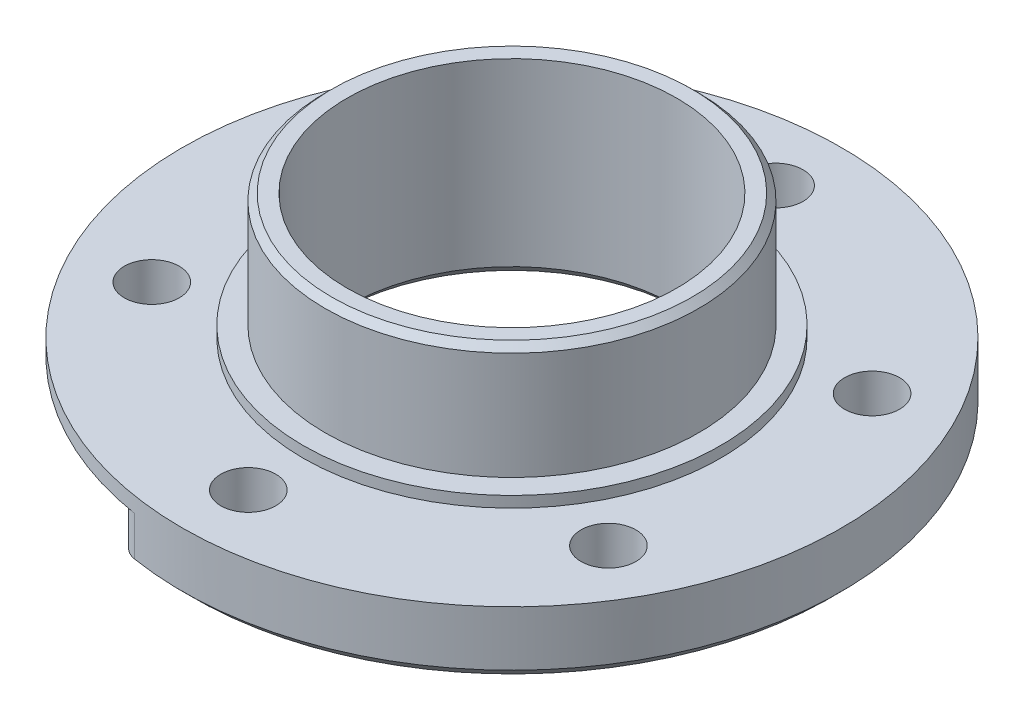
ISO-10303-21;
HEADER;
FILE_DESCRIPTION(('STEP AP214'),'2;1');
FILE_NAME('part.step','',(''),(''),'','','');
FILE_SCHEMA(('AUTOMOTIVE_DESIGN { 1 0 10303 214 1 1 1 1 }'));
ENDSEC;
DATA;
#1=APPLICATION_CONTEXT('core data for automotive mechanical design processes');
#2=APPLICATION_PROTOCOL_DEFINITION('international standard','automotive_design',2000,#1);
#3=PRODUCT_CONTEXT('',#1,'mechanical');
#4=PRODUCT('Part','Part','',(#3));
#5=PRODUCT_RELATED_PRODUCT_CATEGORY('part','',(#4));
#6=PRODUCT_DEFINITION_FORMATION('','',#4);
#7=PRODUCT_DEFINITION_CONTEXT('part definition',#1,'design');
#8=PRODUCT_DEFINITION('design','',#6,#7);
#9=PRODUCT_DEFINITION_SHAPE('','',#8);
#10=(LENGTH_UNIT() NAMED_UNIT(*) SI_UNIT(.MILLI.,.METRE.));
#11=(NAMED_UNIT(*) PLANE_ANGLE_UNIT() SI_UNIT($,.RADIAN.));
#12=(NAMED_UNIT(*) SI_UNIT($,.STERADIAN.) SOLID_ANGLE_UNIT());
#13=UNCERTAINTY_MEASURE_WITH_UNIT(LENGTH_MEASURE(1.E-05),#10,'distance_accuracy_value','');
#14=(GEOMETRIC_REPRESENTATION_CONTEXT(3) GLOBAL_UNCERTAINTY_ASSIGNED_CONTEXT((#13)) GLOBAL_UNIT_ASSIGNED_CONTEXT((#10,
#11,#12)) REPRESENTATION_CONTEXT('',''));
#15=CARTESIAN_POINT('',(0.,0.,0.));
#16=DIRECTION('',(0.,0.,1.));
#17=DIRECTION('',(1.,0.,0.));
#18=AXIS2_PLACEMENT_3D('',#15,#16,#17);
#19=CARTESIAN_POINT('',(0.,0.,0.));
#20=DIRECTION('',(0.,1.,0.));
#21=DIRECTION('',(0.,0.,1.));
#22=AXIS2_PLACEMENT_3D('',#19,#20,#21);
#23=PLANE('',#22);
#24=CARTESIAN_POINT('',(0.893195247705333,0.,8.45294044989533));
#25=DIRECTION('',(0.,1.,0.));
#26=DIRECTION('',(0.,0.,1.));
#27=AXIS2_PLACEMENT_3D('',#24,#25,#26);
#28=CIRCLE('',#27,0.499999999999999);
#29=CARTESIAN_POINT('',(0.460182545813113,0.,8.20294044989533));
#30=VERTEX_POINT('',#29);
#31=CARTESIAN_POINT('',(0.84065435078149,0.,7.95570865872502));
#32=VERTEX_POINT('',#31);
#33=EDGE_CURVE('E267',#30,#32,#28,.F.);
#34=ORIENTED_EDGE('',*,*,#33,.T.);
#35=CARTESIAN_POINT('',(0.,0.,0.));
#36=DIRECTION('',(0.,1.,0.));
#37=DIRECTION('',(0.,0.,1.));
#38=AXIS2_PLACEMENT_3D('',#35,#36,#37);
#39=CIRCLE('',#38,8.);
#40=CARTESIAN_POINT('',(-7.31017297895441,0.,3.24982630578386));
#41=VERTEX_POINT('',#40);
#42=EDGE_CURVE('E270',#32,#41,#39,.T.);
#43=ORIENTED_EDGE('',*,*,#42,.T.);
#44=CARTESIAN_POINT('',(-7.76705879013907,0.,3.45294044989535));
#45=DIRECTION('',(0.,1.,0.));
#46=DIRECTION('',(0.,0.,1.));
#47=AXIS2_PLACEMENT_3D('',#44,#45,#46);
#48=CIRCLE('',#47,0.499999999999999);
#49=CARTESIAN_POINT('',(-7.33404608824685,0.,3.70294044989535));
#50=VERTEX_POINT('',#49);
#51=EDGE_CURVE('E264',#41,#50,#48,.F.);
#52=ORIENTED_EDGE('',*,*,#51,.T.);
#53=DIRECTION('',(-0.499999999999998,0.,0.86602540378444));
#54=VECTOR('',#53,1.);
#55=CARTESIAN_POINT('',(-3.89711431702998,0.,-2.24999999999999));
#56=LINE('',#55,#54);
#57=CARTESIAN_POINT('',(-10.435462732341,0.,9.07475165290615));
#58=VERTEX_POINT('',#57);
#59=EDGE_CURVE('E258',#50,#58,#56,.T.);
#60=ORIENTED_EDGE('',*,*,#59,.T.);
#61=CARTESIAN_POINT('',(-10.8684754342332,0.,8.82475165290615));
#62=DIRECTION('',(0.,1.,0.));
#63=DIRECTION('',(0.,0.,1.));
#64=AXIS2_PLACEMENT_3D('',#61,#62,#63);
#65=CIRCLE('',#64,0.499999999999999);
#66=CARTESIAN_POINT('',(-11.2566352711701,0.,9.13992135479566));
#67=VERTEX_POINT('',#66);
#68=EDGE_CURVE('E251',#58,#67,#65,.F.);
#69=ORIENTED_EDGE('',*,*,#68,.T.);
#70=CARTESIAN_POINT('',(0.,0.,0.));
#71=DIRECTION('',(0.,1.,0.));
#72=DIRECTION('',(0.,0.,1.));
#73=AXIS2_PLACEMENT_3D('',#70,#71,#72);
#74=CIRCLE('',#73,14.5);
#75=CARTESIAN_POINT('',(-2.28708644625981,0.,14.3184927833671));
#76=VERTEX_POINT('',#75);
#77=EDGE_CURVE('E248',#67,#76,#74,.F.);
#78=ORIENTED_EDGE('',*,*,#77,.T.);
#79=CARTESIAN_POINT('',(-2.20822139638879,0.,13.8247516529061));
#80=DIRECTION('',(0.,1.,0.));
#81=DIRECTION('',(0.,0.,1.));
#82=AXIS2_PLACEMENT_3D('',#79,#80,#81);
#83=CIRCLE('',#82,0.499999999999999);
#84=CARTESIAN_POINT('',(-2.641234098281,0.,13.5747516529061));
#85=VERTEX_POINT('',#84);
#86=EDGE_CURVE('E255',#76,#85,#83,.F.);
#87=ORIENTED_EDGE('',*,*,#86,.T.);
#88=DIRECTION('',(0.499999999999998,0.,-0.86602540378444));
#89=VECTOR('',#88,1.);
#90=CARTESIAN_POINT('',(3.89711431702998,0.,2.24999999999999));
#91=LINE('',#90,#89);
#92=EDGE_CURVE('E261',#85,#30,#91,.T.);
#93=ORIENTED_EDGE('',*,*,#92,.T.);
#94=EDGE_LOOP('',(#34,#43,#52,#60,#69,#78,#87,#93));
#95=FACE_BOUND('',#94,.T.);
#96=CARTESIAN_POINT('',(-10.3923048454133,0.,6.00000000000001));
#97=DIRECTION('',(0.,-1.,0.));
#98=DIRECTION('',(0.,0.,-1.));
#99=AXIS2_PLACEMENT_3D('',#96,#97,#98);
#100=CIRCLE('',#99,1.24999999999999);
#101=CARTESIAN_POINT('',(-10.3923048454133,0.,4.75000000000002));
#102=VERTEX_POINT('',#101);
#103=EDGE_CURVE('E361',#102,#102,#100,.T.);
#104=ORIENTED_EDGE('',*,*,#103,.F.);
#105=EDGE_LOOP('',(#104));
#106=FACE_BOUND('',#105,.T.);
#107=CARTESIAN_POINT('',(0.,0.,12.));
#108=DIRECTION('',(0.,-1.,0.));
#109=DIRECTION('',(0.,0.,-1.));
#110=AXIS2_PLACEMENT_3D('',#107,#108,#109);
#111=CIRCLE('',#110,1.24999999999999);
#112=CARTESIAN_POINT('',(0.,0.,10.75));
#113=VERTEX_POINT('',#112);
#114=EDGE_CURVE('E366',#113,#113,#111,.T.);
#115=ORIENTED_EDGE('',*,*,#114,.F.);
#116=EDGE_LOOP('',(#115));
#117=FACE_BOUND('',#116,.T.);
#118=CARTESIAN_POINT('',(10.3923048454133,0.,6.));
#119=DIRECTION('',(0.,-1.,0.));
#120=DIRECTION('',(0.,0.,-1.));
#121=AXIS2_PLACEMENT_3D('',#118,#119,#120);
#122=CIRCLE('',#121,1.24999999999999);
#123=CARTESIAN_POINT('',(10.3923048454133,0.,4.75000000000001));
#124=VERTEX_POINT('',#123);
#125=EDGE_CURVE('E374',#124,#124,#122,.T.);
#126=ORIENTED_EDGE('',*,*,#125,.F.);
#127=EDGE_LOOP('',(#126));
#128=FACE_BOUND('',#127,.T.);
#129=CARTESIAN_POINT('',(10.3923048454133,0.,-6.));
#130=DIRECTION('',(0.,-1.,0.));
#131=DIRECTION('',(0.,0.,-1.));
#132=AXIS2_PLACEMENT_3D('',#129,#130,#131);
#133=CIRCLE('',#132,1.24999999999999);
#134=CARTESIAN_POINT('',(10.3923048454133,0.,-7.24999999999999));
#135=VERTEX_POINT('',#134);
#136=EDGE_CURVE('E382',#135,#135,#133,.T.);
#137=ORIENTED_EDGE('',*,*,#136,.F.);
#138=EDGE_LOOP('',(#137));
#139=FACE_BOUND('',#138,.T.);
#140=CARTESIAN_POINT('',(-10.3923048454133,0.,-6.));
#141=DIRECTION('',(0.,-1.,0.));
#142=DIRECTION('',(0.,0.,-1.));
#143=AXIS2_PLACEMENT_3D('',#140,#141,#142);
#144=CIRCLE('',#143,1.24999999999999);
#145=CARTESIAN_POINT('',(-10.3923048454133,0.,-7.24999999999999));
#146=VERTEX_POINT('',#145);
#147=EDGE_CURVE('E356',#146,#146,#144,.T.);
#148=ORIENTED_EDGE('',*,*,#147,.F.);
#149=EDGE_LOOP('',(#148));
#150=FACE_BOUND('',#149,.T.);
#151=CARTESIAN_POINT('',(0.,0.,-12.));
#152=DIRECTION('',(0.,-1.,0.));
#153=DIRECTION('',(0.,0.,-1.));
#154=AXIS2_PLACEMENT_3D('',#151,#152,#153);
#155=CIRCLE('',#154,1.24999999999999);
#156=CARTESIAN_POINT('',(0.,0.,-13.25));
#157=VERTEX_POINT('',#156);
#158=EDGE_CURVE('E347',#157,#157,#155,.T.);
#159=ORIENTED_EDGE('',*,*,#158,.F.);
#160=EDGE_LOOP('',(#159));
#161=FACE_BOUND('',#160,.T.);
#162=ADVANCED_FACE('F45',(#95,#106,#117,#128,#139,#150,#161),#23,.F.);
#163=CARTESIAN_POINT('',(0.,3.,0.));
#164=DIRECTION('',(0.,1.,0.));
#165=DIRECTION('',(0.,0.,1.));
#166=AXIS2_PLACEMENT_3D('',#163,#164,#165);
#167=PLANE('',#166);
#168=CARTESIAN_POINT('',(0.,3.,-12.));
#169=DIRECTION('',(0.,1.,0.));
#170=DIRECTION('',(0.,0.,1.));
#171=AXIS2_PLACEMENT_3D('',#168,#169,#170);
#172=CIRCLE('',#171,1.24999999999999);
#173=CARTESIAN_POINT('',(0.,3.,-10.75));
#174=VERTEX_POINT('',#173);
#175=EDGE_CURVE('E355',#174,#174,#172,.T.);
#176=ORIENTED_EDGE('',*,*,#175,.F.);
#177=EDGE_LOOP('',(#176));
#178=FACE_BOUND('',#177,.T.);
#179=CARTESIAN_POINT('',(-10.3923048454133,3.,-6.));
#180=DIRECTION('',(0.,1.,0.));
#181=DIRECTION('',(0.,0.,1.));
#182=AXIS2_PLACEMENT_3D('',#179,#180,#181);
#183=CIRCLE('',#182,1.24999999999999);
#184=CARTESIAN_POINT('',(-10.3923048454133,3.,-4.75000000000001));
#185=VERTEX_POINT('',#184);
#186=EDGE_CURVE('E360',#185,#185,#183,.T.);
#187=ORIENTED_EDGE('',*,*,#186,.F.);
#188=EDGE_LOOP('',(#187));
#189=FACE_BOUND('',#188,.T.);
#190=CARTESIAN_POINT('',(-10.3923048454133,3.,6.00000000000001));
#191=DIRECTION('',(0.,1.,0.));
#192=DIRECTION('',(0.,0.,1.));
#193=AXIS2_PLACEMENT_3D('',#190,#191,#192);
#194=CIRCLE('',#193,1.24999999999999);
#195=CARTESIAN_POINT('',(-10.3923048454133,3.,7.25));
#196=VERTEX_POINT('',#195);
#197=EDGE_CURVE('E365',#196,#196,#194,.T.);
#198=ORIENTED_EDGE('',*,*,#197,.F.);
#199=EDGE_LOOP('',(#198));
#200=FACE_BOUND('',#199,.T.);
#201=CARTESIAN_POINT('',(0.,3.,12.));
#202=DIRECTION('',(0.,1.,0.));
#203=DIRECTION('',(0.,0.,1.));
#204=AXIS2_PLACEMENT_3D('',#201,#202,#203);
#205=CIRCLE('',#204,1.24999999999999);
#206=CARTESIAN_POINT('',(0.,3.,13.25));
#207=VERTEX_POINT('',#206);
#208=EDGE_CURVE('E370',#207,#207,#205,.T.);
#209=ORIENTED_EDGE('',*,*,#208,.F.);
#210=EDGE_LOOP('',(#209));
#211=FACE_BOUND('',#210,.T.);
#212=CARTESIAN_POINT('',(10.3923048454133,3.,6.));
#213=DIRECTION('',(0.,1.,0.));
#214=DIRECTION('',(0.,0.,1.));
#215=AXIS2_PLACEMENT_3D('',#212,#213,#214);
#216=CIRCLE('',#215,1.24999999999999);
#217=CARTESIAN_POINT('',(10.3923048454133,3.,7.24999999999999));
#218=VERTEX_POINT('',#217);
#219=EDGE_CURVE('E378',#218,#218,#216,.T.);
#220=ORIENTED_EDGE('',*,*,#219,.F.);
#221=EDGE_LOOP('',(#220));
#222=FACE_BOUND('',#221,.T.);
#223=CARTESIAN_POINT('',(10.3923048454133,3.,-6.));
#224=DIRECTION('',(0.,1.,0.));
#225=DIRECTION('',(0.,0.,1.));
#226=AXIS2_PLACEMENT_3D('',#223,#224,#225);
#227=CIRCLE('',#226,1.24999999999999);
#228=CARTESIAN_POINT('',(10.3923048454133,3.,-4.75000000000001));
#229=VERTEX_POINT('',#228);
#230=EDGE_CURVE('E386',#229,#229,#227,.T.);
#231=ORIENTED_EDGE('',*,*,#230,.F.);
#232=EDGE_LOOP('',(#231));
#233=FACE_BOUND('',#232,.T.);
#234=CARTESIAN_POINT('',(0.,3.,0.));
#235=DIRECTION('',(0.,1.,0.));
#236=DIRECTION('',(0.,0.,1.));
#237=AXIS2_PLACEMENT_3D('',#234,#235,#236);
#238=CIRCLE('',#237,15.);
#239=CARTESIAN_POINT('',(0.,3.,15.));
#240=VERTEX_POINT('',#239);
#241=EDGE_CURVE('E403',#240,#240,#238,.T.);
#242=ORIENTED_EDGE('',*,*,#241,.T.);
#243=EDGE_LOOP('',(#242));
#244=FACE_BOUND('',#243,.T.);
#245=CARTESIAN_POINT('',(0.,3.,0.));
#246=DIRECTION('',(0.,1.,0.));
#247=DIRECTION('',(0.,0.,1.));
#248=AXIS2_PLACEMENT_3D('',#245,#246,#247);
#249=CIRCLE('',#248,9.5);
#250=CARTESIAN_POINT('',(0.,3.,9.5));
#251=VERTEX_POINT('',#250);
#252=EDGE_CURVE('E391',#251,#251,#249,.T.);
#253=ORIENTED_EDGE('',*,*,#252,.F.);
#254=EDGE_LOOP('',(#253));
#255=FACE_BOUND('',#254,.T.);
#256=ADVANCED_FACE('F446',(#178,#189,#200,#211,#222,#233,#244,#255),#167,.T.);
#257=CARTESIAN_POINT('',(0.,3.,0.));
#258=DIRECTION('',(0.,-1.,0.));
#259=DIRECTION('',(0.,0.,-1.));
#260=AXIS2_PLACEMENT_3D('',#257,#258,#259);
#261=CYLINDRICAL_SURFACE('',#260,15.);
#262=DIRECTION('',(0.,-1.,0.));
#263=VECTOR('',#262,1.);
#264=CARTESIAN_POINT('',(-2.36595149613084,3.,14.812233913828));
#265=LINE('',#264,#263);
#266=CARTESIAN_POINT('',(-2.36595149613084,2.3,14.812233913828));
#267=VERTEX_POINT('',#266);
#268=CARTESIAN_POINT('',(-2.36595149613084,0.499999999999999,14.812233913828));
#269=VERTEX_POINT('',#268);
#270=EDGE_CURVE('E201',#267,#269,#265,.T.);
#271=ORIENTED_EDGE('',*,*,#270,.T.);
#272=CARTESIAN_POINT('',(0.,0.499999999999999,0.));
#273=DIRECTION('',(0.,1.,0.));
#274=DIRECTION('',(0.,0.,1.));
#275=AXIS2_PLACEMENT_3D('',#272,#273,#274);
#276=CIRCLE('',#275,15.);
#277=CARTESIAN_POINT('',(-11.644795108107,0.499999999999999,9.45509105668516));
#278=VERTEX_POINT('',#277);
#279=EDGE_CURVE('E11',#269,#278,#276,.T.);
#280=ORIENTED_EDGE('',*,*,#279,.T.);
#281=DIRECTION('',(0.,-1.,0.));
#282=VECTOR('',#281,1.);
#283=CARTESIAN_POINT('',(-11.644795108107,3.,9.45509105668516));
#284=LINE('',#283,#282);
#285=CARTESIAN_POINT('',(-11.644795108107,2.3,9.45509105668516));
#286=VERTEX_POINT('',#285);
#287=EDGE_CURVE('E198',#278,#286,#284,.F.);
#288=ORIENTED_EDGE('',*,*,#287,.T.);
#289=CARTESIAN_POINT('',(0.,2.3,0.));
#290=DIRECTION('',(0.,-1.,0.));
#291=DIRECTION('',(0.,0.,-1.));
#292=AXIS2_PLACEMENT_3D('',#289,#290,#291);
#293=CIRCLE('',#292,15.);
#294=EDGE_CURVE('E342',#267,#286,#293,.T.);
#295=ORIENTED_EDGE('',*,*,#294,.F.);
#296=EDGE_LOOP('',(#271,#280,#288,#295));
#297=FACE_BOUND('',#296,.T.);
#298=ORIENTED_EDGE('',*,*,#241,.F.);
#299=EDGE_LOOP('',(#298));
#300=FACE_BOUND('',#299,.T.);
#301=ADVANCED_FACE('F441',(#297,#300),#261,.T.);
#302=CARTESIAN_POINT('',(0.,3.,0.));
#303=DIRECTION('',(0.,-1.,0.));
#304=DIRECTION('',(0.,0.,-1.));
#305=AXIS2_PLACEMENT_3D('',#302,#303,#304);
#306=CYLINDRICAL_SURFACE('',#305,7.5);
#307=DIRECTION('',(0.,-1.,0.));
#308=VECTOR('',#307,1.);
#309=CARTESIAN_POINT('',(-6.85328716776976,3.,3.04671216167237));
#310=LINE('',#309,#308);
#311=CARTESIAN_POINT('',(-6.85328716776976,3.3,3.04671216167237));
#312=VERTEX_POINT('',#311);
#313=CARTESIAN_POINT('',(-6.85328716776976,0.499999999999999,3.04671216167237));
#314=VERTEX_POINT('',#313);
#315=EDGE_CURVE('E160',#312,#314,#310,.T.);
#316=ORIENTED_EDGE('',*,*,#315,.T.);
#317=CARTESIAN_POINT('',(0.,0.499999999999999,0.));
#318=DIRECTION('',(0.,1.,0.));
#319=DIRECTION('',(0.,0.,1.));
#320=AXIS2_PLACEMENT_3D('',#317,#318,#319);
#321=CIRCLE('',#320,7.5);
#322=CARTESIAN_POINT('',(0.788113453857646,0.499999999999999,7.4584768675547));
#323=VERTEX_POINT('',#322);
#324=EDGE_CURVE('E274',#314,#323,#321,.F.);
#325=ORIENTED_EDGE('',*,*,#324,.T.);
#326=DIRECTION('',(0.,-1.,0.));
#327=VECTOR('',#326,1.);
#328=CARTESIAN_POINT('',(0.788113453857646,3.,7.4584768675547));
#329=LINE('',#328,#327);
#330=CARTESIAN_POINT('',(0.788113453857646,3.3,7.4584768675547));
#331=VERTEX_POINT('',#330);
#332=EDGE_CURVE('E173',#323,#331,#329,.F.);
#333=ORIENTED_EDGE('',*,*,#332,.T.);
#334=CARTESIAN_POINT('',(0.,3.3,0.));
#335=DIRECTION('',(0.,-1.,0.));
#336=DIRECTION('',(0.,0.,-1.));
#337=AXIS2_PLACEMENT_3D('',#334,#335,#336);
#338=CIRCLE('',#337,7.5);
#339=EDGE_CURVE('E151',#331,#312,#338,.T.);
#340=ORIENTED_EDGE('',*,*,#339,.T.);
#341=EDGE_LOOP('',(#316,#325,#333,#340));
#342=FACE_BOUND('',#341,.T.);
#343=CARTESIAN_POINT('',(0.,8.7,0.));
#344=DIRECTION('',(0.,1.,0.));
#345=DIRECTION('',(0.,0.,1.));
#346=AXIS2_PLACEMENT_3D('',#343,#344,#345);
#347=CIRCLE('',#346,7.5);
#348=CARTESIAN_POINT('',(0.,8.7,7.5));
#349=VERTEX_POINT('',#348);
#350=EDGE_CURVE('E396',#349,#349,#347,.T.);
#351=ORIENTED_EDGE('',*,*,#350,.T.);
#352=EDGE_LOOP('',(#351));
#353=FACE_BOUND('',#352,.T.);
#354=ADVANCED_FACE('F170',(#342,#353),#306,.F.);
#355=CARTESIAN_POINT('',(0.,8.7,0.));
#356=DIRECTION('',(0.,1.,0.));
#357=DIRECTION('',(0.,0.,1.));
#358=AXIS2_PLACEMENT_3D('',#355,#356,#357);
#359=PLANE('',#358);
#360=CARTESIAN_POINT('',(0.,8.7,0.));
#361=DIRECTION('',(0.,1.,0.));
#362=DIRECTION('',(0.,0.,1.));
#363=AXIS2_PLACEMENT_3D('',#360,#361,#362);
#364=CIRCLE('',#363,8.2);
#365=CARTESIAN_POINT('',(0.,8.7,8.2));
#366=VERTEX_POINT('',#365);
#367=EDGE_CURVE('E407',#366,#366,#364,.T.);
#368=ORIENTED_EDGE('',*,*,#367,.T.);
#369=EDGE_LOOP('',(#368));
#370=FACE_BOUND('',#369,.T.);
#371=ORIENTED_EDGE('',*,*,#350,.F.);
#372=EDGE_LOOP('',(#371));
#373=FACE_BOUND('',#372,.T.);
#374=ADVANCED_FACE('F435',(#370,#373),#359,.T.);
#375=CARTESIAN_POINT('',(0.,8.7,0.));
#376=DIRECTION('',(0.,-1.,0.));
#377=DIRECTION('',(0.,0.,-1.));
#378=AXIS2_PLACEMENT_3D('',#375,#376,#377);
#379=CYLINDRICAL_SURFACE('',#378,8.5);
#380=CARTESIAN_POINT('',(0.,8.39999999999999,0.));
#381=DIRECTION('',(0.,1.,0.));
#382=DIRECTION('',(0.,0.,1.));
#383=AXIS2_PLACEMENT_3D('',#380,#381,#382);
#384=CIRCLE('',#383,8.5);
#385=CARTESIAN_POINT('',(0.,8.39999999999999,8.5));
#386=VERTEX_POINT('',#385);
#387=EDGE_CURVE('E168',#386,#386,#384,.F.);
#388=ORIENTED_EDGE('',*,*,#387,.T.);
#389=EDGE_LOOP('',(#388));
#390=FACE_BOUND('',#389,.T.);
#391=CARTESIAN_POINT('',(0.,3.5,0.));
#392=DIRECTION('',(0.,1.,0.));
#393=DIRECTION('',(0.,0.,1.));
#394=AXIS2_PLACEMENT_3D('',#391,#392,#393);
#395=CIRCLE('',#394,8.5);
#396=CARTESIAN_POINT('',(0.,3.5,8.5));
#397=VERTEX_POINT('',#396);
#398=EDGE_CURVE('E387',#397,#397,#395,.T.);
#399=ORIENTED_EDGE('',*,*,#398,.T.);
#400=EDGE_LOOP('',(#399));
#401=FACE_BOUND('',#400,.T.);
#402=ADVANCED_FACE('F426',(#390,#401),#379,.T.);
#403=CARTESIAN_POINT('',(0.,3.5,0.));
#404=DIRECTION('',(0.,1.,0.));
#405=DIRECTION('',(0.,0.,1.));
#406=AXIS2_PLACEMENT_3D('',#403,#404,#405);
#407=PLANE('',#406);
#408=CARTESIAN_POINT('',(0.,3.5,0.));
#409=DIRECTION('',(0.,1.,0.));
#410=DIRECTION('',(0.,0.,1.));
#411=AXIS2_PLACEMENT_3D('',#408,#409,#410);
#412=CIRCLE('',#411,9.5);
#413=CARTESIAN_POINT('',(0.,3.5,9.5));
#414=VERTEX_POINT('',#413);
#415=EDGE_CURVE('E392',#414,#414,#412,.T.);
#416=ORIENTED_EDGE('',*,*,#415,.T.);
#417=EDGE_LOOP('',(#416));
#418=FACE_BOUND('',#417,.T.);
#419=ORIENTED_EDGE('',*,*,#398,.F.);
#420=EDGE_LOOP('',(#419));
#421=FACE_BOUND('',#420,.T.);
#422=ADVANCED_FACE('F523',(#418,#421),#407,.T.);
#423=CARTESIAN_POINT('',(0.,3.5,0.));
#424=DIRECTION('',(0.,-1.,0.));
#425=DIRECTION('',(0.,0.,-1.));
#426=AXIS2_PLACEMENT_3D('',#423,#424,#425);
#427=CYLINDRICAL_SURFACE('',#426,9.5);
#428=ORIENTED_EDGE('',*,*,#415,.F.);
#429=EDGE_LOOP('',(#428));
#430=FACE_BOUND('',#429,.T.);
#431=ORIENTED_EDGE('',*,*,#252,.T.);
#432=EDGE_LOOP('',(#431));
#433=FACE_BOUND('',#432,.T.);
#434=ADVANCED_FACE('F520',(#430,#433),#427,.T.);
#435=CARTESIAN_POINT('',(10.3923048454133,0.,-6.));
#436=DIRECTION('',(0.,-1.,0.));
#437=DIRECTION('',(0.,0.,-1.));
#438=AXIS2_PLACEMENT_3D('',#435,#436,#437);
#439=CYLINDRICAL_SURFACE('',#438,1.24999999999999);
#440=ORIENTED_EDGE('',*,*,#230,.T.);
#441=EDGE_LOOP('',(#440));
#442=FACE_BOUND('',#441,.T.);
#443=ORIENTED_EDGE('',*,*,#136,.T.);
#444=EDGE_LOOP('',(#443));
#445=FACE_BOUND('',#444,.T.);
#446=ADVANCED_FACE('F522',(#442,#445),#439,.F.);
#447=CARTESIAN_POINT('',(10.3923048454133,0.,6.));
#448=DIRECTION('',(0.,-1.,0.));
#449=DIRECTION('',(0.,0.,-1.));
#450=AXIS2_PLACEMENT_3D('',#447,#448,#449);
#451=CYLINDRICAL_SURFACE('',#450,1.24999999999999);
#452=ORIENTED_EDGE('',*,*,#219,.T.);
#453=EDGE_LOOP('',(#452));
#454=FACE_BOUND('',#453,.T.);
#455=ORIENTED_EDGE('',*,*,#125,.T.);
#456=EDGE_LOOP('',(#455));
#457=FACE_BOUND('',#456,.T.);
#458=ADVANCED_FACE('F530',(#454,#457),#451,.F.);
#459=CARTESIAN_POINT('',(0.,0.,12.));
#460=DIRECTION('',(0.,-1.,0.));
#461=DIRECTION('',(0.,0.,-1.));
#462=AXIS2_PLACEMENT_3D('',#459,#460,#461);
#463=CYLINDRICAL_SURFACE('',#462,1.24999999999999);
#464=ORIENTED_EDGE('',*,*,#208,.T.);
#465=EDGE_LOOP('',(#464));
#466=FACE_BOUND('',#465,.T.);
#467=ORIENTED_EDGE('',*,*,#114,.T.);
#468=EDGE_LOOP('',(#467));
#469=FACE_BOUND('',#468,.T.);
#470=ADVANCED_FACE('F576',(#466,#469),#463,.F.);
#471=CARTESIAN_POINT('',(-10.3923048454133,0.,6.00000000000001));
#472=DIRECTION('',(0.,-1.,0.));
#473=DIRECTION('',(0.,0.,-1.));
#474=AXIS2_PLACEMENT_3D('',#471,#472,#473);
#475=CYLINDRICAL_SURFACE('',#474,1.24999999999999);
#476=ORIENTED_EDGE('',*,*,#197,.T.);
#477=EDGE_LOOP('',(#476));
#478=FACE_BOUND('',#477,.T.);
#479=ORIENTED_EDGE('',*,*,#103,.T.);
#480=EDGE_LOOP('',(#479));
#481=FACE_BOUND('',#480,.T.);
#482=ADVANCED_FACE('F587',(#478,#481),#475,.F.);
#483=CARTESIAN_POINT('',(-10.3923048454133,0.,-6.));
#484=DIRECTION('',(0.,-1.,0.));
#485=DIRECTION('',(0.,0.,-1.));
#486=AXIS2_PLACEMENT_3D('',#483,#484,#485);
#487=CYLINDRICAL_SURFACE('',#486,1.24999999999999);
#488=ORIENTED_EDGE('',*,*,#186,.T.);
#489=EDGE_LOOP('',(#488));
#490=FACE_BOUND('',#489,.T.);
#491=ORIENTED_EDGE('',*,*,#147,.T.);
#492=EDGE_LOOP('',(#491));
#493=FACE_BOUND('',#492,.T.);
#494=ADVANCED_FACE('F598',(#490,#493),#487,.F.);
#495=CARTESIAN_POINT('',(0.,0.,-12.));
#496=DIRECTION('',(0.,-1.,0.));
#497=DIRECTION('',(0.,0.,-1.));
#498=AXIS2_PLACEMENT_3D('',#495,#496,#497);
#499=CYLINDRICAL_SURFACE('',#498,1.24999999999999);
#500=ORIENTED_EDGE('',*,*,#175,.T.);
#501=EDGE_LOOP('',(#500));
#502=FACE_BOUND('',#501,.T.);
#503=ORIENTED_EDGE('',*,*,#158,.T.);
#504=EDGE_LOOP('',(#503));
#505=FACE_BOUND('',#504,.T.);
#506=ADVANCED_FACE('F432',(#502,#505),#499,.F.);
#507=CARTESIAN_POINT('',(0.,8.7,0.));
#508=DIRECTION('',(0.,-1.,0.));
#509=DIRECTION('',(0.,0.,-1.));
#510=AXIS2_PLACEMENT_3D('',#507,#508,#509);
#511=CONICAL_SURFACE('',#510,8.2,0.785398163397443);
#512=ORIENTED_EDGE('',*,*,#387,.F.);
#513=EDGE_LOOP('',(#512));
#514=FACE_BOUND('',#513,.T.);
#515=ORIENTED_EDGE('',*,*,#367,.F.);
#516=EDGE_LOOP('',(#515));
#517=FACE_BOUND('',#516,.T.);
#518=ADVANCED_FACE('F429',(#514,#517),#511,.T.);
#519=CARTESIAN_POINT('',(-3.46410161513776,2.3,-1.99999999999999));
#520=DIRECTION('',(-0.86602540378444,0.,-0.499999999999998));
#521=DIRECTION('',(-0.499999999999998,0.,0.86602540378444));
#522=AXIS2_PLACEMENT_3D('',#519,#520,#521);
#523=PLANE('',#522);
#524=DIRECTION('',(0.,-1.,0.));
#525=VECTOR('',#524,1.);
#526=CARTESIAN_POINT('',(-10.0024500304487,2.3,9.32475165290615));
#527=LINE('',#526,#525);
#528=CARTESIAN_POINT('',(-10.0024500304487,2.3,9.32475165290614));
#529=VERTEX_POINT('',#528);
#530=CARTESIAN_POINT('',(-10.0024500304487,0.499999999999999,9.32475165290615));
#531=VERTEX_POINT('',#530);
#532=EDGE_CURVE('E191',#529,#531,#527,.T.);
#533=ORIENTED_EDGE('',*,*,#532,.T.);
#534=DIRECTION('',(0.499999999999998,0.,-0.86602540378444));
#535=VECTOR('',#534,1.);
#536=CARTESIAN_POINT('',(-3.46410161513776,0.499999999999999,-1.99999999999999));
#537=LINE('',#536,#535);
#538=CARTESIAN_POINT('',(-6.90103338635463,0.499999999999999,3.95294044989535));
#539=VERTEX_POINT('',#538);
#540=EDGE_CURVE('E285',#531,#539,#537,.T.);
#541=ORIENTED_EDGE('',*,*,#540,.T.);
#542=DIRECTION('',(0.,1.,0.));
#543=VECTOR('',#542,1.);
#544=CARTESIAN_POINT('',(-6.90103338635463,2.3,3.95294044989535));
#545=LINE('',#544,#543);
#546=CARTESIAN_POINT('',(-6.90103338635463,2.46287597992307,3.95294044989535));
#547=VERTEX_POINT('',#546);
#548=EDGE_CURVE('E195',#539,#547,#545,.T.);
#549=ORIENTED_EDGE('',*,*,#548,.T.);
#550=CARTESIAN_POINT('',(-6.90103338635463,2.46287597992307,3.95294044989535));
#551=CARTESIAN_POINT('',(-6.9323908668895,2.42744883644928,4.0072531993791));
#552=CARTESIAN_POINT('',(-6.96531614595984,2.3976477750784,4.06428145558232));
#553=CARTESIAN_POINT('',(-7.0325106849061,2.35010317092084,4.18066581102841));
#554=CARTESIAN_POINT('',(-7.0667378378873,2.33212209460164,4.23994897899027));
#555=CARTESIAN_POINT('',(-7.11992341914815,2.31327634707257,4.33206910796415));
#556=CARTESIAN_POINT('',(-7.13854365639798,2.30833971130353,4.36432030492984));
#557=CARTESIAN_POINT('',(-7.17613885320285,2.30168447980492,4.42943709591643));
#558=CARTESIAN_POINT('',(-7.19511544557667,2.3000027728294,4.46230551806241));
#559=CARTESIAN_POINT('',(-7.21410161513772,2.29999999999976,4.49519052838327));
#560=B_SPLINE_CURVE_WITH_KNOTS('',3,(#550,#551,#552,#553,#554,#555,#556,#557,#558,#559),
.UNSPECIFIED.,.F.,.F.,(4,2,2,2,4),(0.,0.215787084246655,0.427093171463114,0.539667211198458,
0.653509771900556),.UNSPECIFIED.);
#561=CARTESIAN_POINT('',(-7.21410161513774,2.3,4.49519052838331));
#562=VERTEX_POINT('',#561);
#563=EDGE_CURVE('E153',#547,#562,#560,.T.);
#564=ORIENTED_EDGE('',*,*,#563,.T.);
#565=DIRECTION('',(0.499999999999998,0.,-0.86602540378444));
#566=VECTOR('',#565,1.);
#567=CARTESIAN_POINT('',(-3.46410161513776,2.3,-1.99999999999999));
#568=LINE('',#567,#566);
#569=EDGE_CURVE('E339',#529,#562,#568,.T.);
#570=ORIENTED_EDGE('',*,*,#569,.F.);
#571=EDGE_LOOP('',(#533,#541,#549,#564,#570));
#572=FACE_BOUND('',#571,.T.);
#573=ADVANCED_FACE('F219',(#572),#523,.F.);
#574=CARTESIAN_POINT('',(3.46410161513776,2.3,1.99999999999999));
#575=DIRECTION('',(0.86602540378444,0.,0.499999999999998));
#576=DIRECTION('',(0.499999999999998,0.,-0.86602540378444));
#577=AXIS2_PLACEMENT_3D('',#574,#575,#576);
#578=PLANE('',#577);
#579=DIRECTION('',(0.,1.,0.));
#580=VECTOR('',#579,1.);
#581=CARTESIAN_POINT('',(0.0271698439208909,0.,7.95294044989533));
#582=LINE('',#581,#580);
#583=CARTESIAN_POINT('',(0.0271698439208907,2.46287597992307,7.95294044989533));
#584=VERTEX_POINT('',#583);
#585=CARTESIAN_POINT('',(0.0271698439208909,0.499999999999999,7.95294044989533));
#586=VERTEX_POINT('',#585);
#587=EDGE_CURVE('E187',#584,#586,#582,.F.);
#588=ORIENTED_EDGE('',*,*,#587,.T.);
#589=DIRECTION('',(-0.499999999999998,0.,0.86602540378444));
#590=VECTOR('',#589,1.);
#591=CARTESIAN_POINT('',(3.46410161513776,0.499999999999999,1.99999999999999));
#592=LINE('',#591,#590);
#593=CARTESIAN_POINT('',(-3.07424680017323,0.499999999999999,13.3247516529061));
#594=VERTEX_POINT('',#593);
#595=EDGE_CURVE('E282',#586,#594,#592,.T.);
#596=ORIENTED_EDGE('',*,*,#595,.T.);
#597=DIRECTION('',(0.,-1.,0.));
#598=VECTOR('',#597,1.);
#599=CARTESIAN_POINT('',(-3.07424680017323,2.3,13.3247516529061));
#600=LINE('',#599,#598);
#601=CARTESIAN_POINT('',(-3.07424680017323,2.3,13.3247516529061));
#602=VERTEX_POINT('',#601);
#603=EDGE_CURVE('E184',#594,#602,#600,.F.);
#604=ORIENTED_EDGE('',*,*,#603,.T.);
#605=DIRECTION('',(-0.499999999999998,0.,0.86602540378444));
#606=VECTOR('',#605,1.);
#607=CARTESIAN_POINT('',(3.46410161513776,2.3,1.99999999999999));
#608=LINE('',#607,#606);
#609=CARTESIAN_POINT('',(-0.285898384862229,2.3,8.49519052838329));
#610=VERTEX_POINT('',#609);
#611=EDGE_CURVE('E247',#610,#602,#608,.T.);
#612=ORIENTED_EDGE('',*,*,#611,.F.);
#613=CARTESIAN_POINT('',(-0.285898384862228,2.3,8.49519052838329));
#614=CARTESIAN_POINT('',(-0.264224735105972,2.30000994380199,8.45765066582));
#615=CARTESIAN_POINT('',(-0.24257464535587,2.30219667947712,8.4201516103844));
#616=CARTESIAN_POINT('',(-0.199470940327572,2.31090248401241,8.34549380328093));
#617=CARTESIAN_POINT('',(-0.178017549704897,2.31742600061347,8.30833544072783));
#618=CARTESIAN_POINT('',(-0.115392543730376,2.34299405974528,8.19986574855566));
#619=CARTESIAN_POINT('',(-0.0747658298249511,2.36804548793804,8.1294982159269));
#620=CARTESIAN_POINT('',(-0.0251383862323899,2.40999474139333,8.04354096217482));
#621=CARTESIAN_POINT('',(-0.014513217027878,2.41968797476592,8.02513762927359));
#622=CARTESIAN_POINT('',(0.00651936771082144,2.44033968954578,7.98870812389166));
#623=CARTESIAN_POINT('',(0.016924684449459,2.45130671788535,7.9706855866315));
#624=CARTESIAN_POINT('',(0.0271698439207603,2.46287597992369,7.95294044989556));
#625=B_SPLINE_CURVE_WITH_KNOTS('',3,(#613,#614,#615,#616,#617,#618,#619,#620,#621,#622,#623,
#624),.UNSPECIFIED.,.F.,.F.,(4,2,2,2,2,4),(0.,0.129894173219143,0.259921769998134,
0.512951483073678,0.582999806770093,0.653548724253039),.UNSPECIFIED.);
#626=EDGE_CURVE('E212',#610,#584,#625,.T.);
#627=ORIENTED_EDGE('',*,*,#626,.T.);
#628=EDGE_LOOP('',(#588,#596,#604,#612,#627));
#629=FACE_BOUND('',#628,.T.);
#630=ADVANCED_FACE('F507',(#629),#578,.F.);
#631=CARTESIAN_POINT('',(0.,2.3,0.));
#632=DIRECTION('',(0.,-1.,0.));
#633=DIRECTION('',(0.,0.,-1.));
#634=AXIS2_PLACEMENT_3D('',#631,#632,#633);
#635=PLANE('',#634);
#636=ORIENTED_EDGE('',*,*,#569,.T.);
#637=CARTESIAN_POINT('',(0.,2.3,0.));
#638=DIRECTION('',(0.,-1.,0.));
#639=DIRECTION('',(0.,0.,-1.));
#640=AXIS2_PLACEMENT_3D('',#637,#638,#639);
#641=CIRCLE('',#640,8.5);
#642=EDGE_CURVE('E178',#562,#610,#641,.F.);
#643=ORIENTED_EDGE('',*,*,#642,.T.);
#644=ORIENTED_EDGE('',*,*,#611,.T.);
#645=CARTESIAN_POINT('',(-2.20822139638879,2.3,13.8247516529061));
#646=DIRECTION('',(0.,-1.,0.));
#647=DIRECTION('',(0.,0.,-1.));
#648=AXIS2_PLACEMENT_3D('',#645,#646,#647);
#649=CIRCLE('',#648,1.);
#650=EDGE_CURVE('E504',#602,#267,#649,.F.);
#651=ORIENTED_EDGE('',*,*,#650,.T.);
#652=ORIENTED_EDGE('',*,*,#294,.T.);
#653=CARTESIAN_POINT('',(-10.8684754342332,2.3,8.82475165290615));
#654=DIRECTION('',(0.,-1.,0.));
#655=DIRECTION('',(0.,0.,-1.));
#656=AXIS2_PLACEMENT_3D('',#653,#654,#655);
#657=CIRCLE('',#656,1.);
#658=EDGE_CURVE('E252',#286,#529,#657,.F.);
#659=ORIENTED_EDGE('',*,*,#658,.T.);
#660=EDGE_LOOP('',(#636,#643,#644,#651,#652,#659));
#661=FACE_BOUND('',#660,.T.);
#662=ADVANCED_FACE('F510',(#661),#635,.T.);
#663=CARTESIAN_POINT('',(0.893195247705333,3.,8.45294044989533));
#664=DIRECTION('',(0.,-1.,0.));
#665=DIRECTION('',(0.,0.,-1.));
#666=AXIS2_PLACEMENT_3D('',#663,#664,#665);
#667=CYLINDRICAL_SURFACE('',#666,1.);
#668=ORIENTED_EDGE('',*,*,#332,.F.);
#669=CARTESIAN_POINT('',(0.893195247705333,0.499999999999999,8.45294044989533));
#670=DIRECTION('',(0.,1.,0.));
#671=DIRECTION('',(0.,0.,1.));
#672=AXIS2_PLACEMENT_3D('',#669,#670,#671);
#673=CIRCLE('',#672,1.);
#674=EDGE_CURVE('E277',#323,#586,#673,.T.);
#675=ORIENTED_EDGE('',*,*,#674,.T.);
#676=ORIENTED_EDGE('',*,*,#587,.F.);
#677=CARTESIAN_POINT('',(0.0271698439208907,2.46287597992307,7.95294044989533));
#678=CARTESIAN_POINT('',(0.0459973510286923,2.48413774298184,7.92035304339701));
#679=CARTESIAN_POINT('',(0.0661931906091203,2.50684005335499,7.8895962464022));
#680=CARTESIAN_POINT('',(0.108740870425801,2.55451121011109,7.83171378421457));
#681=CARTESIAN_POINT('',(0.131085960431762,2.57947294655658,7.80457735049806));
#682=CARTESIAN_POINT('',(0.177282715508792,2.63097299956977,7.75391660129418));
#683=CARTESIAN_POINT('',(0.201120565393501,2.65749675345027,7.73036456080895));
#684=CARTESIAN_POINT('',(0.250128848196438,2.71193337666029,7.68642322886361));
#685=CARTESIAN_POINT('',(0.275300492714617,2.73984750755837,7.66603688149777));
#686=CARTESIAN_POINT('',(0.363130429074269,2.83708455840752,7.60147572051341));
#687=CARTESIAN_POINT('',(0.42833457534896,2.90900088985863,7.56455715003543));
#688=CARTESIAN_POINT('',(0.562262685065052,3.05582850959071,7.50646322702261));
#689=CARTESIAN_POINT('',(0.630991810562054,3.13074415277213,7.48531171090322));
#690=CARTESIAN_POINT('',(0.728254512588668,3.23576104586744,7.46623934608768));
#691=CARTESIAN_POINT('',(0.755969208873828,3.26557468967715,7.46200486456403));
#692=CARTESIAN_POINT('',(0.785243011417108,3.29692681678935,7.45878331836123));
#693=CARTESIAN_POINT('',(0.786678069338498,3.29846340939622,7.45862853806585));
#694=CARTESIAN_POINT('',(0.788113453857646,3.3,7.4584768675547));
#695=B_SPLINE_CURVE_WITH_KNOTS('',3,(#677,#678,#679,#680,#681,#682,#683,#684,#685,#686,#687,
#688,#689,#690,#691,#692,#693,#694),.UNSPECIFIED.,.F.,.F.,(4,2,2,2,2,2,2,2,4),(0.,
0.129484090444622,0.258574018196578,0.386608249697188,0.514760848959463,0.824622423221441,
1.13495149715962,1.25767163355955,1.26399619582833),.UNSPECIFIED.);
#696=EDGE_CURVE('E157',#331,#584,#695,.F.);
#697=ORIENTED_EDGE('',*,*,#696,.F.);
#698=EDGE_LOOP('',(#668,#675,#676,#697));
#699=FACE_BOUND('',#698,.T.);
#700=ADVANCED_FACE('F229',(#699),#667,.T.);
#701=CARTESIAN_POINT('',(-7.76705879013907,3.,3.45294044989535));
#702=DIRECTION('',(0.,-1.,0.));
#703=DIRECTION('',(0.,0.,-1.));
#704=AXIS2_PLACEMENT_3D('',#701,#702,#703);
#705=CYLINDRICAL_SURFACE('',#704,1.);
#706=ORIENTED_EDGE('',*,*,#548,.F.);
#707=CARTESIAN_POINT('',(-7.76705879013907,0.499999999999999,3.45294044989535));
#708=DIRECTION('',(0.,1.,0.));
#709=DIRECTION('',(0.,0.,1.));
#710=AXIS2_PLACEMENT_3D('',#707,#708,#709);
#711=CIRCLE('',#710,1.);
#712=EDGE_CURVE('E163',#539,#314,#711,.T.);
#713=ORIENTED_EDGE('',*,*,#712,.T.);
#714=ORIENTED_EDGE('',*,*,#315,.F.);
#715=CARTESIAN_POINT('',(-6.90103338635463,2.46287597992307,3.95294044989535));
#716=CARTESIAN_POINT('',(-6.88222561803753,2.48413774298184,3.9203416472009));
#717=CARTESIAN_POINT('',(-6.8656873702912,2.50684005335499,3.88747313857609));
#718=CARTESIAN_POINT('',(-6.83683352751146,2.55451121011108,3.82168453588895));
#719=CARTESIAN_POINT('',(-6.82450523154783,2.57947294655658,3.78876490343568));
#720=CARTESIAN_POINT('',(-6.80373011330103,2.63097299956976,3.72342696536462));
#721=CARTESIAN_POINT('',(-6.79525237287222,2.65749675345027,3.69100676155025));
#722=CARTESIAN_POINT('',(-6.7817022045329,2.71193337666029,3.62659367767438));
#723=CARTESIAN_POINT('',(-6.7766329320828,2.73984750755836,3.59460122038368));
#724=CARTESIAN_POINT('',(-6.76463629475235,2.83708455840754,3.48625768379129));
#725=CARTESIAN_POINT('',(-6.76526594798433,2.9090008898587,3.4113299514464));
#726=CARTESIAN_POINT('',(-6.78191918970784,3.05582850959064,3.26629784464488));
#727=CARTESIAN_POINT('',(-6.79796600216848,3.13074415277186,3.1962009179247));
#728=CARTESIAN_POINT('',(-6.83008020074111,3.23576104586756,3.10243276472155));
#729=CARTESIAN_POINT('',(-6.84027038031227,3.26557468967747,3.07631389291879));
#730=CARTESIAN_POINT('',(-6.85211734073295,3.29692681678938,3.04935126314927));
#731=CARTESIAN_POINT('',(-6.85270082602584,3.29846340939623,3.04803107638574));
#732=CARTESIAN_POINT('',(-6.85328716776976,3.3,3.04671216167237));
#733=B_SPLINE_CURVE_WITH_KNOTS('',3,(#715,#716,#717,#718,#719,#720,#721,#722,#723,#724,#725,
#726,#727,#728,#729,#730,#731,#732),.UNSPECIFIED.,.F.,.F.,(4,2,2,2,2,2,2,2,4),(0.,
0.129484090444617,0.258574018196569,0.386608249697183,0.514760848959462,0.824622423221442,
1.13495149715961,1.25767163355954,1.26399619582833),.UNSPECIFIED.);
#734=EDGE_CURVE('E145',#547,#312,#733,.T.);
#735=ORIENTED_EDGE('',*,*,#734,.F.);
#736=EDGE_LOOP('',(#706,#713,#714,#735));
#737=FACE_BOUND('',#736,.T.);
#738=ADVANCED_FACE('F161',(#737),#705,.T.);
#739=CARTESIAN_POINT('',(0.,3.3,0.));
#740=DIRECTION('',(0.,-1.,0.));
#741=DIRECTION('',(0.,0.,-1.));
#742=AXIS2_PLACEMENT_3D('',#739,#740,#741);
#743=TOROIDAL_SURFACE('',#742,8.5,1.);
#744=ORIENTED_EDGE('',*,*,#626,.F.);
#745=ORIENTED_EDGE('',*,*,#642,.F.);
#746=ORIENTED_EDGE('',*,*,#563,.F.);
#747=ORIENTED_EDGE('',*,*,#734,.T.);
#748=ORIENTED_EDGE('',*,*,#339,.F.);
#749=ORIENTED_EDGE('',*,*,#696,.T.);
#750=EDGE_LOOP('',(#744,#745,#746,#747,#748,#749));
#751=FACE_BOUND('',#750,.T.);
#752=ADVANCED_FACE('F148',(#751),#743,.T.);
#753=CARTESIAN_POINT('',(-2.20822139638879,3.,13.8247516529061));
#754=DIRECTION('',(0.,-1.,0.));
#755=DIRECTION('',(0.,0.,-1.));
#756=AXIS2_PLACEMENT_3D('',#753,#754,#755);
#757=CYLINDRICAL_SURFACE('',#756,1.);
#758=ORIENTED_EDGE('',*,*,#603,.F.);
#759=CARTESIAN_POINT('',(-2.20822139638879,0.499999999999999,13.8247516529061));
#760=DIRECTION('',(0.,1.,0.));
#761=DIRECTION('',(0.,0.,1.));
#762=AXIS2_PLACEMENT_3D('',#759,#760,#761);
#763=CIRCLE('',#762,1.);
#764=EDGE_CURVE('E70',#594,#269,#763,.T.);
#765=ORIENTED_EDGE('',*,*,#764,.T.);
#766=ORIENTED_EDGE('',*,*,#270,.F.);
#767=ORIENTED_EDGE('',*,*,#650,.F.);
#768=EDGE_LOOP('',(#758,#765,#766,#767));
#769=FACE_BOUND('',#768,.T.);
#770=ADVANCED_FACE('F226',(#769),#757,.T.);
#771=CARTESIAN_POINT('',(-10.8684754342332,3.,8.82475165290615));
#772=DIRECTION('',(0.,-1.,0.));
#773=DIRECTION('',(0.,0.,-1.));
#774=AXIS2_PLACEMENT_3D('',#771,#772,#773);
#775=CYLINDRICAL_SURFACE('',#774,1.);
#776=ORIENTED_EDGE('',*,*,#287,.F.);
#777=CARTESIAN_POINT('',(-10.8684754342332,0.499999999999999,8.82475165290615));
#778=DIRECTION('',(0.,1.,0.));
#779=DIRECTION('',(0.,0.,1.));
#780=AXIS2_PLACEMENT_3D('',#777,#778,#779);
#781=CIRCLE('',#780,1.);
#782=EDGE_CURVE('E56',#278,#531,#781,.T.);
#783=ORIENTED_EDGE('',*,*,#782,.T.);
#784=ORIENTED_EDGE('',*,*,#532,.F.);
#785=ORIENTED_EDGE('',*,*,#658,.F.);
#786=EDGE_LOOP('',(#776,#783,#784,#785));
#787=FACE_BOUND('',#786,.T.);
#788=ADVANCED_FACE('F334',(#787),#775,.T.);
#789=CARTESIAN_POINT('',(0.,0.499999999999999,0.));
#790=DIRECTION('',(0.,1.,0.));
#791=DIRECTION('',(0.,0.,1.));
#792=AXIS2_PLACEMENT_3D('',#789,#790,#791);
#793=CONICAL_SURFACE('',#792,15.,0.78539816339745);
#794=DIRECTION('',(0.548940905764692,-0.707106781186547,-0.445717266861224));
#795=VECTOR('',#794,1.);
#796=CARTESIAN_POINT('',(-11.644795108107,0.499999999999999,9.45509105668516));
#797=LINE('',#796,#795);
#798=EDGE_CURVE('E313',#278,#67,#797,.T.);
#799=ORIENTED_EDGE('',*,*,#798,.F.);
#800=ORIENTED_EDGE('',*,*,#279,.F.);
#801=DIRECTION('',(-0.111532023124838,0.707106781186547,0.698255402999276));
#802=VECTOR('',#801,1.);
#803=CARTESIAN_POINT('',(-2.28708644625981,0.,14.3184927833671));
#804=LINE('',#803,#802);
#805=EDGE_CURVE('E50',#76,#269,#804,.T.);
#806=ORIENTED_EDGE('',*,*,#805,.F.);
#807=ORIENTED_EDGE('',*,*,#77,.F.);
#808=EDGE_LOOP('',(#799,#800,#806,#807));
#809=FACE_BOUND('',#808,.T.);
#810=ADVANCED_FACE('F48',(#809),#793,.T.);
#811=CARTESIAN_POINT('',(-2.20822139638879,0.,13.8247516529061));
#812=DIRECTION('',(0.,1.,0.));
#813=DIRECTION('',(0.,0.,1.));
#814=AXIS2_PLACEMENT_3D('',#811,#812,#813);
#815=CONICAL_SURFACE('',#814,0.499999999999999,0.785398163397451);
#816=ORIENTED_EDGE('',*,*,#805,.T.);
#817=ORIENTED_EDGE('',*,*,#764,.F.);
#818=DIRECTION('',(-0.612372435695797,0.707106781186546,-0.353553390593272));
#819=VECTOR('',#818,1.);
#820=CARTESIAN_POINT('',(-2.641234098281,0.,13.5747516529061));
#821=LINE('',#820,#819);
#822=EDGE_CURVE('E310',#85,#594,#821,.T.);
#823=ORIENTED_EDGE('',*,*,#822,.F.);
#824=ORIENTED_EDGE('',*,*,#86,.F.);
#825=EDGE_LOOP('',(#816,#817,#823,#824));
#826=FACE_BOUND('',#825,.T.);
#827=ADVANCED_FACE('F325',(#826),#815,.T.);
#828=CARTESIAN_POINT('',(-10.8684754342332,0.,8.82475165290615));
#829=DIRECTION('',(0.,1.,0.));
#830=DIRECTION('',(0.,0.,1.));
#831=AXIS2_PLACEMENT_3D('',#828,#829,#830);
#832=CONICAL_SURFACE('',#831,0.499999999999999,0.785398163397451);
#833=ORIENTED_EDGE('',*,*,#798,.T.);
#834=ORIENTED_EDGE('',*,*,#68,.F.);
#835=DIRECTION('',(-0.612372435695796,-0.707106781186546,-0.353553390593274));
#836=VECTOR('',#835,1.);
#837=CARTESIAN_POINT('',(-10.0024500304487,0.499999999999999,9.32475165290615));
#838=LINE('',#837,#836);
#839=EDGE_CURVE('E306',#531,#58,#838,.T.);
#840=ORIENTED_EDGE('',*,*,#839,.F.);
#841=ORIENTED_EDGE('',*,*,#782,.F.);
#842=EDGE_LOOP('',(#833,#834,#840,#841));
#843=FACE_BOUND('',#842,.T.);
#844=ADVANCED_FACE('F330',(#843),#832,.T.);
#845=CARTESIAN_POINT('',(3.46410161513776,0.499999999999999,1.99999999999999));
#846=DIRECTION('',(0.612372435695793,0.70710678118655,0.353553390593271));
#847=DIRECTION('',(-0.499999999999998,0.,0.86602540378444));
#848=AXIS2_PLACEMENT_3D('',#845,#846,#847);
#849=PLANE('',#848);
#850=ORIENTED_EDGE('',*,*,#822,.T.);
#851=ORIENTED_EDGE('',*,*,#595,.F.);
#852=DIRECTION('',(-0.612372435695798,0.707106781186545,-0.353553390593274));
#853=VECTOR('',#852,1.);
#854=CARTESIAN_POINT('',(0.460182545813113,0.,8.20294044989533));
#855=LINE('',#854,#853);
#856=EDGE_CURVE('E302',#30,#586,#855,.T.);
#857=ORIENTED_EDGE('',*,*,#856,.F.);
#858=ORIENTED_EDGE('',*,*,#92,.F.);
#859=EDGE_LOOP('',(#850,#851,#857,#858));
#860=FACE_BOUND('',#859,.T.);
#861=ADVANCED_FACE('F475',(#860),#849,.F.);
#862=CARTESIAN_POINT('',(-3.46410161513776,0.499999999999999,-1.99999999999999));
#863=DIRECTION('',(-0.612372435695793,0.70710678118655,-0.353553390593271));
#864=DIRECTION('',(0.499999999999998,0.,-0.86602540378444));
#865=AXIS2_PLACEMENT_3D('',#862,#863,#864);
#866=PLANE('',#865);
#867=ORIENTED_EDGE('',*,*,#839,.T.);
#868=ORIENTED_EDGE('',*,*,#59,.F.);
#869=DIRECTION('',(-0.612372435695797,-0.707106781186546,-0.353553390593273));
#870=VECTOR('',#869,1.);
#871=CARTESIAN_POINT('',(-6.90103338635463,0.499999999999999,3.95294044989535));
#872=LINE('',#871,#870);
#873=EDGE_CURVE('E298',#539,#50,#872,.T.);
#874=ORIENTED_EDGE('',*,*,#873,.F.);
#875=ORIENTED_EDGE('',*,*,#540,.F.);
#876=EDGE_LOOP('',(#867,#868,#874,#875));
#877=FACE_BOUND('',#876,.T.);
#878=ADVANCED_FACE('F480',(#877),#866,.F.);
#879=CARTESIAN_POINT('',(0.893195247705333,0.,8.45294044989533));
#880=DIRECTION('',(0.,1.,0.));
#881=DIRECTION('',(0.,0.,1.));
#882=AXIS2_PLACEMENT_3D('',#879,#880,#881);
#883=CONICAL_SURFACE('',#882,0.499999999999999,0.785398163397451);
#884=ORIENTED_EDGE('',*,*,#856,.T.);
#885=ORIENTED_EDGE('',*,*,#674,.F.);
#886=DIRECTION('',(-0.0743040490089461,0.707106781186545,-0.703191942716126));
#887=VECTOR('',#886,1.);
#888=CARTESIAN_POINT('',(0.84065435078149,0.,7.95570865872502));
#889=LINE('',#888,#887);
#890=EDGE_CURVE('E295',#32,#323,#889,.T.);
#891=ORIENTED_EDGE('',*,*,#890,.F.);
#892=ORIENTED_EDGE('',*,*,#33,.F.);
#893=EDGE_LOOP('',(#884,#885,#891,#892));
#894=FACE_BOUND('',#893,.T.);
#895=ADVANCED_FACE('F485',(#894),#883,.T.);
#896=CARTESIAN_POINT('',(-7.76705879013907,0.,3.45294044989535));
#897=DIRECTION('',(0.,1.,0.));
#898=DIRECTION('',(0.,0.,1.));
#899=AXIS2_PLACEMENT_3D('',#896,#897,#898);
#900=CONICAL_SURFACE('',#899,0.499999999999999,0.785398163397451);
#901=ORIENTED_EDGE('',*,*,#873,.T.);
#902=ORIENTED_EDGE('',*,*,#51,.F.);
#903=DIRECTION('',(-0.646134110633168,-0.707106781186546,0.287246777312275));
#904=VECTOR('',#903,1.);
#905=CARTESIAN_POINT('',(-6.85328716776976,0.499999999999999,3.04671216167237));
#906=LINE('',#905,#904);
#907=EDGE_CURVE('E292',#314,#41,#906,.T.);
#908=ORIENTED_EDGE('',*,*,#907,.F.);
#909=ORIENTED_EDGE('',*,*,#712,.F.);
#910=EDGE_LOOP('',(#901,#902,#908,#909));
#911=FACE_BOUND('',#910,.T.);
#912=ADVANCED_FACE('F490',(#911),#900,.T.);
#913=CARTESIAN_POINT('',(0.,0.,0.));
#914=DIRECTION('',(0.,-1.,0.));
#915=DIRECTION('',(0.,0.,-1.));
#916=AXIS2_PLACEMENT_3D('',#913,#914,#915);
#917=CONICAL_SURFACE('',#916,8.,0.785398163397452);
#918=ORIENTED_EDGE('',*,*,#890,.T.);
#919=ORIENTED_EDGE('',*,*,#324,.F.);
#920=ORIENTED_EDGE('',*,*,#907,.T.);
#921=ORIENTED_EDGE('',*,*,#42,.F.);
#922=EDGE_LOOP('',(#918,#919,#920,#921));
#923=FACE_BOUND('',#922,.T.);
#924=ADVANCED_FACE('F494',(#923),#917,.F.);
#925=CLOSED_SHELL('',(#162,#256,#301,#354,#374,#402,#422,#434,#446,#458,#470,#482,#494,#506,
#518,#573,#630,#662,#700,#738,#752,#770,#788,#810,#827,#844,#861,#878,#895,#912,#924));
#926=MANIFOLD_SOLID_BREP('B2',#925);
#927=ADVANCED_BREP_SHAPE_REPRESENTATION('',(#18,#926),#14);
#928=SHAPE_DEFINITION_REPRESENTATION(#9,#927);
ENDSEC;
END-ISO-10303-21;
